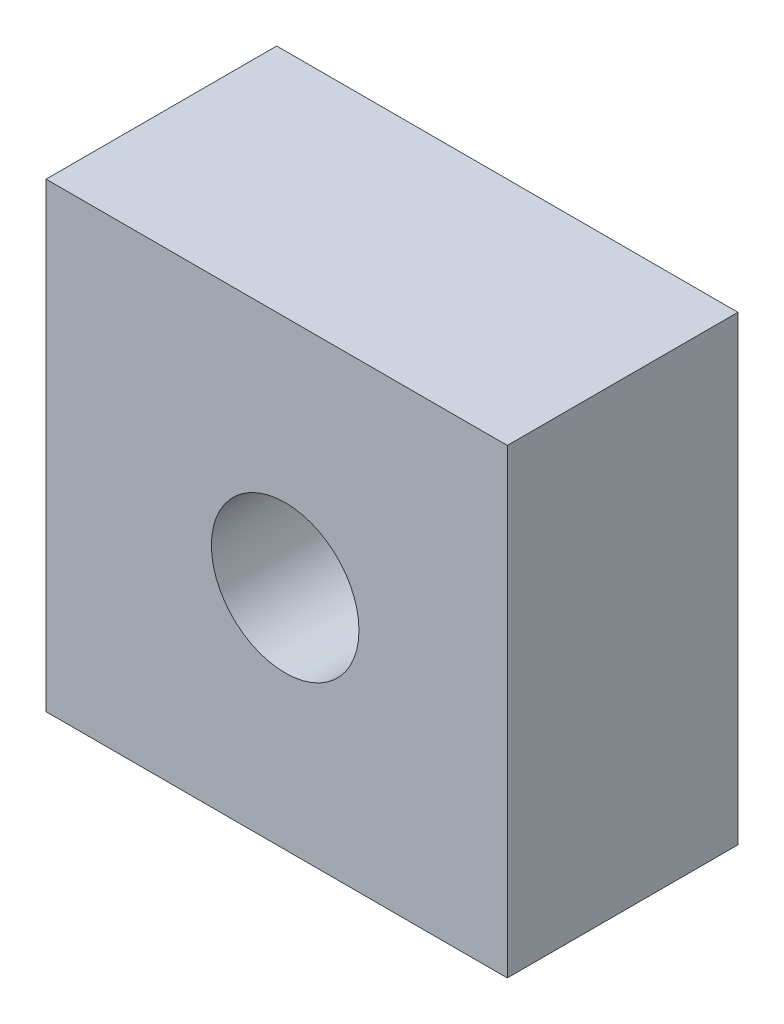
ISO-10303-21;
HEADER;
FILE_DESCRIPTION(('STEP AP214'),'2;1');
FILE_NAME('part.step','',(''),(''),'','','');
FILE_SCHEMA(('AUTOMOTIVE_DESIGN { 1 0 10303 214 1 1 1 1 }'));
ENDSEC;
DATA;
#1=APPLICATION_CONTEXT('core data for automotive mechanical design processes');
#2=APPLICATION_PROTOCOL_DEFINITION('international standard','automotive_design',2000,#1);
#3=PRODUCT_CONTEXT('',#1,'mechanical');
#4=PRODUCT('Part','Part','',(#3));
#5=PRODUCT_RELATED_PRODUCT_CATEGORY('part','',(#4));
#6=PRODUCT_DEFINITION_FORMATION('','',#4);
#7=PRODUCT_DEFINITION_CONTEXT('part definition',#1,'design');
#8=PRODUCT_DEFINITION('design','',#6,#7);
#9=PRODUCT_DEFINITION_SHAPE('','',#8);
#10=(LENGTH_UNIT() NAMED_UNIT(*) SI_UNIT(.MILLI.,.METRE.));
#11=(NAMED_UNIT(*) PLANE_ANGLE_UNIT() SI_UNIT($,.RADIAN.));
#12=(NAMED_UNIT(*) SI_UNIT($,.STERADIAN.) SOLID_ANGLE_UNIT());
#13=UNCERTAINTY_MEASURE_WITH_UNIT(LENGTH_MEASURE(1.E-05),#10,'distance_accuracy_value','');
#14=(GEOMETRIC_REPRESENTATION_CONTEXT(3) GLOBAL_UNCERTAINTY_ASSIGNED_CONTEXT((#13)) GLOBAL_UNIT_ASSIGNED_CONTEXT((#10,
#11,#12)) REPRESENTATION_CONTEXT('',''));
#15=CARTESIAN_POINT('',(0.,0.,0.));
#16=DIRECTION('',(0.,0.,1.));
#17=DIRECTION('',(1.,0.,0.));
#18=AXIS2_PLACEMENT_3D('',#15,#16,#17);
#19=CARTESIAN_POINT('',(0.,100.,0.));
#20=DIRECTION('',(1.,0.,0.));
#21=DIRECTION('',(0.,0.,-1.));
#22=AXIS2_PLACEMENT_3D('',#19,#20,#21);
#23=PLANE('',#22);
#24=DIRECTION('',(0.,0.,1.));
#25=VECTOR('',#24,1.);
#26=CARTESIAN_POINT('',(0.,0.,0.));
#27=LINE('',#26,#25);
#28=CARTESIAN_POINT('',(0.,0.,0.));
#29=VERTEX_POINT('',#28);
#30=CARTESIAN_POINT('',(0.,0.,50.));
#31=VERTEX_POINT('',#30);
#32=EDGE_CURVE('E97',#29,#31,#27,.T.);
#33=ORIENTED_EDGE('',*,*,#32,.T.);
#34=DIRECTION('',(0.,-1.,0.));
#35=VECTOR('',#34,1.);
#36=CARTESIAN_POINT('',(0.,100.,50.));
#37=LINE('',#36,#35);
#38=CARTESIAN_POINT('',(0.,100.,50.));
#39=VERTEX_POINT('',#38);
#40=EDGE_CURVE('E11',#39,#31,#37,.T.);
#41=ORIENTED_EDGE('',*,*,#40,.F.);
#42=DIRECTION('',(0.,0.,1.));
#43=VECTOR('',#42,1.);
#44=CARTESIAN_POINT('',(0.,100.,0.));
#45=LINE('',#44,#43);
#46=CARTESIAN_POINT('',(0.,100.,0.));
#47=VERTEX_POINT('',#46);
#48=EDGE_CURVE('E85',#47,#39,#45,.T.);
#49=ORIENTED_EDGE('',*,*,#48,.F.);
#50=DIRECTION('',(0.,-1.,0.));
#51=VECTOR('',#50,1.);
#52=CARTESIAN_POINT('',(0.,100.,0.));
#53=LINE('',#52,#51);
#54=EDGE_CURVE('E93',#47,#29,#53,.T.);
#55=ORIENTED_EDGE('',*,*,#54,.T.);
#56=EDGE_LOOP('',(#33,#41,#49,#55));
#57=FACE_BOUND('',#56,.T.);
#58=ADVANCED_FACE('F34',(#57),#23,.F.);
#59=CARTESIAN_POINT('',(0.,100.,50.));
#60=DIRECTION('',(0.,0.,-1.));
#61=DIRECTION('',(-1.,0.,0.));
#62=AXIS2_PLACEMENT_3D('',#59,#60,#61);
#63=PLANE('',#62);
#64=CARTESIAN_POINT('',(51.8404023264694,49.1987639070421,50.));
#65=DIRECTION('',(0.,0.,-1.));
#66=DIRECTION('',(-1.,0.,0.));
#67=AXIS2_PLACEMENT_3D('',#64,#65,#66);
#68=CIRCLE('',#67,16.);
#69=CARTESIAN_POINT('',(35.8404023264694,49.1987639070421,50.));
#70=VERTEX_POINT('',#69);
#71=EDGE_CURVE('E100',#70,#70,#68,.T.);
#72=ORIENTED_EDGE('',*,*,#71,.T.);
#73=EDGE_LOOP('',(#72));
#74=FACE_BOUND('',#73,.T.);
#75=DIRECTION('',(1.,0.,0.));
#76=VECTOR('',#75,1.);
#77=CARTESIAN_POINT('',(0.,0.,50.));
#78=LINE('',#77,#76);
#79=CARTESIAN_POINT('',(100.,0.,50.));
#80=VERTEX_POINT('',#79);
#81=EDGE_CURVE('E89',#31,#80,#78,.T.);
#82=ORIENTED_EDGE('',*,*,#81,.T.);
#83=DIRECTION('',(0.,-1.,0.));
#84=VECTOR('',#83,1.);
#85=CARTESIAN_POINT('',(100.,100.,50.));
#86=LINE('',#85,#84);
#87=CARTESIAN_POINT('',(100.,100.,50.));
#88=VERTEX_POINT('',#87);
#89=EDGE_CURVE('E42',#88,#80,#86,.T.);
#90=ORIENTED_EDGE('',*,*,#89,.F.);
#91=DIRECTION('',(1.,0.,0.));
#92=VECTOR('',#91,1.);
#93=CARTESIAN_POINT('',(0.,100.,50.));
#94=LINE('',#93,#92);
#95=EDGE_CURVE('E80',#39,#88,#94,.T.);
#96=ORIENTED_EDGE('',*,*,#95,.F.);
#97=ORIENTED_EDGE('',*,*,#40,.T.);
#98=EDGE_LOOP('',(#82,#90,#96,#97));
#99=FACE_BOUND('',#98,.T.);
#100=ADVANCED_FACE('F88',(#74,#99),#63,.F.);
#101=CARTESIAN_POINT('',(100.,100.,0.));
#102=DIRECTION('',(-1.,0.,0.));
#103=DIRECTION('',(0.,0.,1.));
#104=AXIS2_PLACEMENT_3D('',#101,#102,#103);
#105=PLANE('',#104);
#106=DIRECTION('',(0.,0.,-1.));
#107=VECTOR('',#106,1.);
#108=CARTESIAN_POINT('',(100.,0.,0.));
#109=LINE('',#108,#107);
#110=CARTESIAN_POINT('',(100.,0.,0.));
#111=VERTEX_POINT('',#110);
#112=EDGE_CURVE('E67',#80,#111,#109,.T.);
#113=ORIENTED_EDGE('',*,*,#112,.T.);
#114=DIRECTION('',(0.,-1.,0.));
#115=VECTOR('',#114,1.);
#116=CARTESIAN_POINT('',(100.,100.,0.));
#117=LINE('',#116,#115);
#118=CARTESIAN_POINT('',(100.,100.,0.));
#119=VERTEX_POINT('',#118);
#120=EDGE_CURVE('E90',#119,#111,#117,.T.);
#121=ORIENTED_EDGE('',*,*,#120,.F.);
#122=DIRECTION('',(0.,0.,-1.));
#123=VECTOR('',#122,1.);
#124=CARTESIAN_POINT('',(100.,100.,0.));
#125=LINE('',#124,#123);
#126=EDGE_CURVE('E83',#88,#119,#125,.T.);
#127=ORIENTED_EDGE('',*,*,#126,.F.);
#128=ORIENTED_EDGE('',*,*,#89,.T.);
#129=EDGE_LOOP('',(#113,#121,#127,#128));
#130=FACE_BOUND('',#129,.T.);
#131=ADVANCED_FACE('F91',(#130),#105,.F.);
#132=CARTESIAN_POINT('',(0.,100.,0.));
#133=DIRECTION('',(0.,0.,1.));
#134=DIRECTION('',(1.,0.,0.));
#135=AXIS2_PLACEMENT_3D('',#132,#133,#134);
#136=PLANE('',#135);
#137=CARTESIAN_POINT('',(51.8404023264694,49.1987639070421,0.));
#138=DIRECTION('',(0.,0.,-1.));
#139=DIRECTION('',(-1.,0.,0.));
#140=AXIS2_PLACEMENT_3D('',#137,#138,#139);
#141=CIRCLE('',#140,16.);
#142=CARTESIAN_POINT('',(35.8404023264694,49.1987639070421,0.));
#143=VERTEX_POINT('',#142);
#144=EDGE_CURVE('E113',#143,#143,#141,.T.);
#145=ORIENTED_EDGE('',*,*,#144,.F.);
#146=EDGE_LOOP('',(#145));
#147=FACE_BOUND('',#146,.T.);
#148=DIRECTION('',(-1.,0.,0.));
#149=VECTOR('',#148,1.);
#150=CARTESIAN_POINT('',(0.,0.,0.));
#151=LINE('',#150,#149);
#152=EDGE_CURVE('E73',#111,#29,#151,.T.);
#153=ORIENTED_EDGE('',*,*,#152,.T.);
#154=ORIENTED_EDGE('',*,*,#54,.F.);
#155=DIRECTION('',(-1.,0.,0.));
#156=VECTOR('',#155,1.);
#157=CARTESIAN_POINT('',(0.,100.,0.));
#158=LINE('',#157,#156);
#159=EDGE_CURVE('E50',#119,#47,#158,.T.);
#160=ORIENTED_EDGE('',*,*,#159,.F.);
#161=ORIENTED_EDGE('',*,*,#120,.T.);
#162=EDGE_LOOP('',(#153,#154,#160,#161));
#163=FACE_BOUND('',#162,.T.);
#164=ADVANCED_FACE('F105',(#147,#163),#136,.F.);
#165=CARTESIAN_POINT('',(0.,100.,0.));
#166=DIRECTION('',(0.,1.,0.));
#167=DIRECTION('',(0.,0.,1.));
#168=AXIS2_PLACEMENT_3D('',#165,#166,#167);
#169=PLANE('',#168);
#170=ORIENTED_EDGE('',*,*,#48,.T.);
#171=ORIENTED_EDGE('',*,*,#95,.T.);
#172=ORIENTED_EDGE('',*,*,#126,.T.);
#173=ORIENTED_EDGE('',*,*,#159,.T.);
#174=EDGE_LOOP('',(#170,#171,#172,#173));
#175=FACE_BOUND('',#174,.T.);
#176=ADVANCED_FACE('F81',(#175),#169,.T.);
#177=CARTESIAN_POINT('',(0.,0.,0.));
#178=DIRECTION('',(0.,1.,0.));
#179=DIRECTION('',(0.,0.,1.));
#180=AXIS2_PLACEMENT_3D('',#177,#178,#179);
#181=PLANE('',#180);
#182=ORIENTED_EDGE('',*,*,#32,.F.);
#183=ORIENTED_EDGE('',*,*,#152,.F.);
#184=ORIENTED_EDGE('',*,*,#112,.F.);
#185=ORIENTED_EDGE('',*,*,#81,.F.);
#186=EDGE_LOOP('',(#182,#183,#184,#185));
#187=FACE_BOUND('',#186,.T.);
#188=ADVANCED_FACE('F108',(#187),#181,.F.);
#189=CARTESIAN_POINT('',(51.8404023264694,49.1987639070421,100.));
#190=DIRECTION('',(0.,0.,-1.));
#191=DIRECTION('',(-1.,0.,0.));
#192=AXIS2_PLACEMENT_3D('',#189,#190,#191);
#193=CYLINDRICAL_SURFACE('',#192,16.);
#194=ORIENTED_EDGE('',*,*,#144,.T.);
#195=EDGE_LOOP('',(#194));
#196=FACE_BOUND('',#195,.T.);
#197=ORIENTED_EDGE('',*,*,#71,.F.);
#198=EDGE_LOOP('',(#197));
#199=FACE_BOUND('',#198,.T.);
#200=ADVANCED_FACE('F117',(#196,#199),#193,.F.);
#201=CLOSED_SHELL('',(#58,#100,#131,#164,#176,#188,#200));
#202=MANIFOLD_SOLID_BREP('B2',#201);
#203=ADVANCED_BREP_SHAPE_REPRESENTATION('',(#18,#202),#14);
#204=SHAPE_DEFINITION_REPRESENTATION(#9,#203);
ENDSEC;
END-ISO-10303-21;
